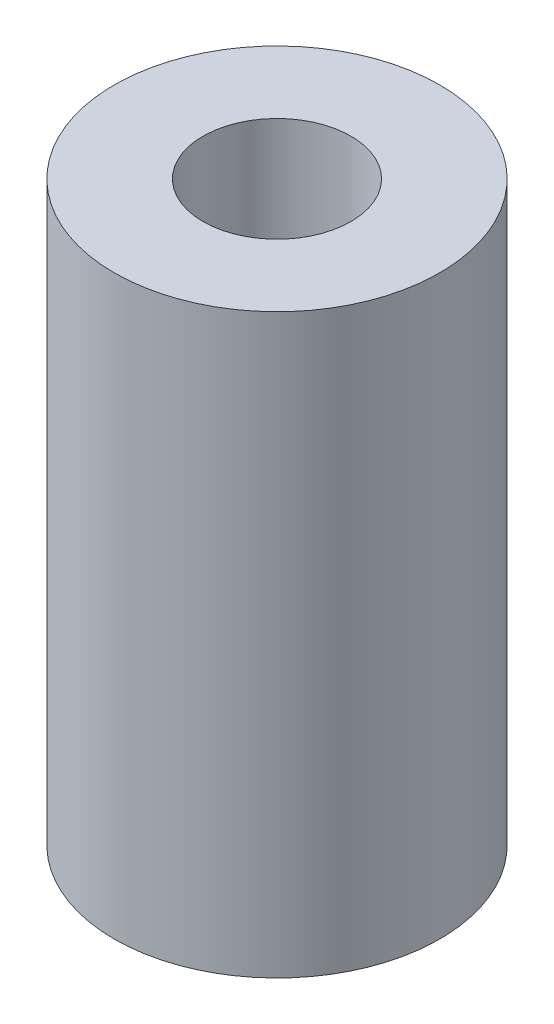
ISO-10303-21;
HEADER;
FILE_DESCRIPTION(('STEP AP214'),'2;1');
FILE_NAME('part.step','',(''),(''),'','','');
FILE_SCHEMA(('AUTOMOTIVE_DESIGN { 1 0 10303 214 1 1 1 1 }'));
ENDSEC;
DATA;
#1=APPLICATION_CONTEXT('core data for automotive mechanical design processes');
#2=APPLICATION_PROTOCOL_DEFINITION('international standard','automotive_design',2000,#1);
#3=PRODUCT_CONTEXT('',#1,'mechanical');
#4=PRODUCT('Part','Part','',(#3));
#5=PRODUCT_RELATED_PRODUCT_CATEGORY('part','',(#4));
#6=PRODUCT_DEFINITION_FORMATION('','',#4);
#7=PRODUCT_DEFINITION_CONTEXT('part definition',#1,'design');
#8=PRODUCT_DEFINITION('design','',#6,#7);
#9=PRODUCT_DEFINITION_SHAPE('','',#8);
#10=(LENGTH_UNIT() NAMED_UNIT(*) SI_UNIT(.MILLI.,.METRE.));
#11=(NAMED_UNIT(*) PLANE_ANGLE_UNIT() SI_UNIT($,.RADIAN.));
#12=(NAMED_UNIT(*) SI_UNIT($,.STERADIAN.) SOLID_ANGLE_UNIT());
#13=UNCERTAINTY_MEASURE_WITH_UNIT(LENGTH_MEASURE(1.E-05),#10,'distance_accuracy_value','');
#14=(GEOMETRIC_REPRESENTATION_CONTEXT(3) GLOBAL_UNCERTAINTY_ASSIGNED_CONTEXT((#13)) GLOBAL_UNIT_ASSIGNED_CONTEXT((#10,
#11,#12)) REPRESENTATION_CONTEXT('',''));
#15=CARTESIAN_POINT('',(0.,0.,0.));
#16=DIRECTION('',(0.,0.,1.));
#17=DIRECTION('',(1.,0.,0.));
#18=AXIS2_PLACEMENT_3D('',#15,#16,#17);
#19=CARTESIAN_POINT('',(0.,7.8,0.));
#20=DIRECTION('',(0.,1.,0.));
#21=DIRECTION('',(0.,0.,1.));
#22=AXIS2_PLACEMENT_3D('',#19,#20,#21);
#23=PLANE('',#22);
#24=CARTESIAN_POINT('',(0.,7.8,0.));
#25=DIRECTION('',(0.,1.,0.));
#26=DIRECTION('',(0.,0.,1.));
#27=AXIS2_PLACEMENT_3D('',#24,#25,#26);
#28=CIRCLE('',#27,2.2);
#29=CARTESIAN_POINT('',(0.,7.8,2.2));
#30=VERTEX_POINT('',#29);
#31=EDGE_CURVE('E10',#30,#30,#28,.T.);
#32=ORIENTED_EDGE('',*,*,#31,.T.);
#33=EDGE_LOOP('',(#32));
#34=FACE_BOUND('',#33,.T.);
#35=CARTESIAN_POINT('',(0.,7.8,0.));
#36=DIRECTION('',(0.,1.,0.));
#37=DIRECTION('',(0.,0.,1.));
#38=AXIS2_PLACEMENT_3D('',#35,#36,#37);
#39=CIRCLE('',#38,1.);
#40=CARTESIAN_POINT('',(0.,7.8,1.));
#41=VERTEX_POINT('',#40);
#42=EDGE_CURVE('E42',#41,#41,#39,.T.);
#43=ORIENTED_EDGE('',*,*,#42,.F.);
#44=EDGE_LOOP('',(#43));
#45=FACE_BOUND('',#44,.T.);
#46=ADVANCED_FACE('F31',(#34,#45),#23,.T.);
#47=CARTESIAN_POINT('',(0.,0.,0.));
#48=DIRECTION('',(0.,1.,0.));
#49=DIRECTION('',(0.,0.,1.));
#50=AXIS2_PLACEMENT_3D('',#47,#48,#49);
#51=PLANE('',#50);
#52=CARTESIAN_POINT('',(0.,0.,0.));
#53=DIRECTION('',(0.,1.,0.));
#54=DIRECTION('',(0.,0.,1.));
#55=AXIS2_PLACEMENT_3D('',#52,#53,#54);
#56=CIRCLE('',#55,2.2);
#57=CARTESIAN_POINT('',(0.,0.,2.2));
#58=VERTEX_POINT('',#57);
#59=EDGE_CURVE('E35',#58,#58,#56,.T.);
#60=ORIENTED_EDGE('',*,*,#59,.F.);
#61=EDGE_LOOP('',(#60));
#62=FACE_BOUND('',#61,.T.);
#63=CARTESIAN_POINT('',(0.,0.,0.));
#64=DIRECTION('',(0.,1.,0.));
#65=DIRECTION('',(0.,0.,1.));
#66=AXIS2_PLACEMENT_3D('',#63,#64,#65);
#67=CIRCLE('',#66,1.);
#68=CARTESIAN_POINT('',(0.,0.,1.));
#69=VERTEX_POINT('',#68);
#70=EDGE_CURVE('E44',#69,#69,#67,.T.);
#71=ORIENTED_EDGE('',*,*,#70,.T.);
#72=EDGE_LOOP('',(#71));
#73=FACE_BOUND('',#72,.T.);
#74=ADVANCED_FACE('F54',(#62,#73),#51,.F.);
#75=CARTESIAN_POINT('',(0.,7.8,0.));
#76=DIRECTION('',(0.,-1.,0.));
#77=DIRECTION('',(0.,0.,-1.));
#78=AXIS2_PLACEMENT_3D('',#75,#76,#77);
#79=CYLINDRICAL_SURFACE('',#78,2.2);
#80=ORIENTED_EDGE('',*,*,#31,.F.);
#81=EDGE_LOOP('',(#80));
#82=FACE_BOUND('',#81,.T.);
#83=ORIENTED_EDGE('',*,*,#59,.T.);
#84=EDGE_LOOP('',(#83));
#85=FACE_BOUND('',#84,.T.);
#86=ADVANCED_FACE('F33',(#82,#85),#79,.T.);
#87=CARTESIAN_POINT('',(0.,7.8,0.));
#88=DIRECTION('',(0.,-1.,0.));
#89=DIRECTION('',(0.,0.,-1.));
#90=AXIS2_PLACEMENT_3D('',#87,#88,#89);
#91=CYLINDRICAL_SURFACE('',#90,1.);
#92=ORIENTED_EDGE('',*,*,#42,.T.);
#93=EDGE_LOOP('',(#92));
#94=FACE_BOUND('',#93,.T.);
#95=ORIENTED_EDGE('',*,*,#70,.F.);
#96=EDGE_LOOP('',(#95));
#97=FACE_BOUND('',#96,.T.);
#98=ADVANCED_FACE('F50',(#94,#97),#91,.F.);
#99=CLOSED_SHELL('',(#46,#74,#86,#98));
#100=MANIFOLD_SOLID_BREP('B2',#99);
#101=ADVANCED_BREP_SHAPE_REPRESENTATION('',(#18,#100),#14);
#102=SHAPE_DEFINITION_REPRESENTATION(#9,#101);
ENDSEC;
END-ISO-10303-21;
